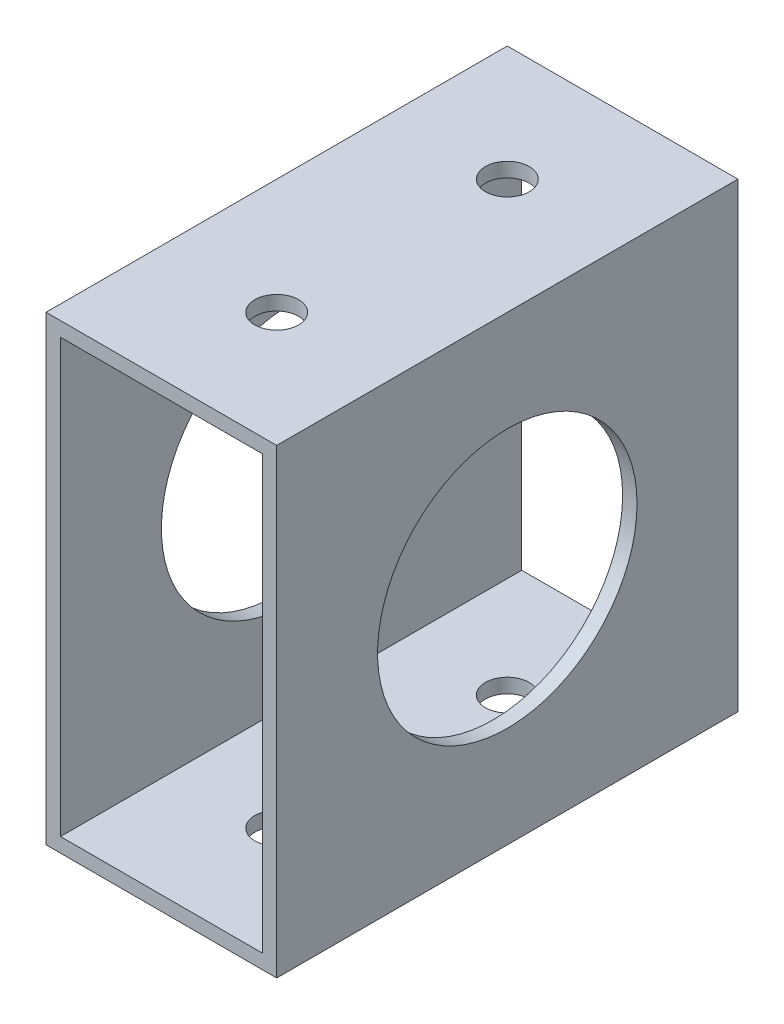
ISO-10303-21;
HEADER;
FILE_DESCRIPTION(('STEP AP214'),'2;1');
FILE_NAME('part.step','',(''),(''),'','','');
FILE_SCHEMA(('AUTOMOTIVE_DESIGN { 1 0 10303 214 1 1 1 1 }'));
ENDSEC;
DATA;
#1=APPLICATION_CONTEXT('core data for automotive mechanical design processes');
#2=APPLICATION_PROTOCOL_DEFINITION('international standard','automotive_design',2000,#1);
#3=PRODUCT_CONTEXT('',#1,'mechanical');
#4=PRODUCT('Part','Part','',(#3));
#5=PRODUCT_RELATED_PRODUCT_CATEGORY('part','',(#4));
#6=PRODUCT_DEFINITION_FORMATION('','',#4);
#7=PRODUCT_DEFINITION_CONTEXT('part definition',#1,'design');
#8=PRODUCT_DEFINITION('design','',#6,#7);
#9=PRODUCT_DEFINITION_SHAPE('','',#8);
#10=(LENGTH_UNIT() NAMED_UNIT(*) SI_UNIT(.MILLI.,.METRE.));
#11=(NAMED_UNIT(*) PLANE_ANGLE_UNIT() SI_UNIT($,.RADIAN.));
#12=(NAMED_UNIT(*) SI_UNIT($,.STERADIAN.) SOLID_ANGLE_UNIT());
#13=UNCERTAINTY_MEASURE_WITH_UNIT(LENGTH_MEASURE(1.E-05),#10,'distance_accuracy_value','');
#14=(GEOMETRIC_REPRESENTATION_CONTEXT(3) GLOBAL_UNCERTAINTY_ASSIGNED_CONTEXT((#13)) GLOBAL_UNIT_ASSIGNED_CONTEXT((#10,
#11,#12)) REPRESENTATION_CONTEXT('',''));
#15=CARTESIAN_POINT('',(0.,0.,0.));
#16=DIRECTION('',(0.,0.,1.));
#17=DIRECTION('',(1.,0.,0.));
#18=AXIS2_PLACEMENT_3D('',#15,#16,#17);
#19=CARTESIAN_POINT('',(0.,0.,50.8));
#20=DIRECTION('',(0.,0.,-1.));
#21=DIRECTION('',(-1.,0.,0.));
#22=AXIS2_PLACEMENT_3D('',#19,#20,#21);
#23=PLANE('',#22);
#24=DIRECTION('',(0.,-1.,0.));
#25=VECTOR('',#24,1.);
#26=CARTESIAN_POINT('',(0.,0.,50.8));
#27=LINE('',#26,#25);
#28=CARTESIAN_POINT('',(0.,50.8,50.8));
#29=VERTEX_POINT('',#28);
#30=CARTESIAN_POINT('',(0.,0.,50.8));
#31=VERTEX_POINT('',#30);
#32=EDGE_CURVE('E138',#29,#31,#27,.T.);
#33=ORIENTED_EDGE('',*,*,#32,.T.);
#34=DIRECTION('',(1.,0.,0.));
#35=VECTOR('',#34,1.);
#36=CARTESIAN_POINT('',(0.,0.,50.8));
#37=LINE('',#36,#35);
#38=CARTESIAN_POINT('',(25.4,0.,50.8));
#39=VERTEX_POINT('',#38);
#40=EDGE_CURVE('E141',#31,#39,#37,.T.);
#41=ORIENTED_EDGE('',*,*,#40,.T.);
#42=DIRECTION('',(0.,1.,0.));
#43=VECTOR('',#42,1.);
#44=CARTESIAN_POINT('',(25.4,0.,50.8));
#45=LINE('',#44,#43);
#46=CARTESIAN_POINT('',(25.4,50.8,50.8));
#47=VERTEX_POINT('',#46);
#48=EDGE_CURVE('E144',#39,#47,#45,.T.);
#49=ORIENTED_EDGE('',*,*,#48,.T.);
#50=DIRECTION('',(-1.,0.,0.));
#51=VECTOR('',#50,1.);
#52=CARTESIAN_POINT('',(0.,50.8,50.8));
#53=LINE('',#52,#51);
#54=EDGE_CURVE('E146',#47,#29,#53,.T.);
#55=ORIENTED_EDGE('',*,*,#54,.T.);
#56=EDGE_LOOP('',(#33,#41,#49,#55));
#57=FACE_BOUND('',#56,.T.);
#58=DIRECTION('',(0.,-1.,0.));
#59=VECTOR('',#58,1.);
#60=CARTESIAN_POINT('',(1.5875,49.2125,50.8));
#61=LINE('',#60,#59);
#62=CARTESIAN_POINT('',(1.5875,49.2125,50.8));
#63=VERTEX_POINT('',#62);
#64=CARTESIAN_POINT('',(1.58750000000001,1.5875,50.8));
#65=VERTEX_POINT('',#64);
#66=EDGE_CURVE('E100',#63,#65,#61,.T.);
#67=ORIENTED_EDGE('',*,*,#66,.F.);
#68=DIRECTION('',(-1.,0.,0.));
#69=VECTOR('',#68,1.);
#70=CARTESIAN_POINT('',(1.5875,49.2125,50.8));
#71=LINE('',#70,#69);
#72=CARTESIAN_POINT('',(23.8125,49.2125,50.8));
#73=VERTEX_POINT('',#72);
#74=EDGE_CURVE('E122',#73,#63,#71,.T.);
#75=ORIENTED_EDGE('',*,*,#74,.F.);
#76=DIRECTION('',(0.,1.,0.));
#77=VECTOR('',#76,1.);
#78=CARTESIAN_POINT('',(23.8125,49.2125,50.8));
#79=LINE('',#78,#77);
#80=CARTESIAN_POINT('',(23.8125,1.5875,50.8));
#81=VERTEX_POINT('',#80);
#82=EDGE_CURVE('E120',#81,#73,#79,.T.);
#83=ORIENTED_EDGE('',*,*,#82,.F.);
#84=DIRECTION('',(1.,0.,0.));
#85=VECTOR('',#84,1.);
#86=CARTESIAN_POINT('',(1.58750000000001,1.5875,50.8));
#87=LINE('',#86,#85);
#88=EDGE_CURVE('E108',#65,#81,#87,.T.);
#89=ORIENTED_EDGE('',*,*,#88,.F.);
#90=EDGE_LOOP('',(#67,#75,#83,#89));
#91=FACE_BOUND('',#90,.T.);
#92=ADVANCED_FACE('F33',(#57,#91),#23,.F.);
#93=CARTESIAN_POINT('',(0.,0.,0.));
#94=DIRECTION('',(0.,0.,-1.));
#95=DIRECTION('',(-1.,0.,0.));
#96=AXIS2_PLACEMENT_3D('',#93,#94,#95);
#97=PLANE('',#96);
#98=DIRECTION('',(0.,-1.,0.));
#99=VECTOR('',#98,1.);
#100=CARTESIAN_POINT('',(0.,0.,0.));
#101=LINE('',#100,#99);
#102=CARTESIAN_POINT('',(0.,50.8,0.));
#103=VERTEX_POINT('',#102);
#104=CARTESIAN_POINT('',(0.,0.,0.));
#105=VERTEX_POINT('',#104);
#106=EDGE_CURVE('E116',#103,#105,#101,.T.);
#107=ORIENTED_EDGE('',*,*,#106,.F.);
#108=DIRECTION('',(-1.,0.,0.));
#109=VECTOR('',#108,1.);
#110=CARTESIAN_POINT('',(0.,50.8,0.));
#111=LINE('',#110,#109);
#112=CARTESIAN_POINT('',(25.4,50.8,0.));
#113=VERTEX_POINT('',#112);
#114=EDGE_CURVE('E142',#113,#103,#111,.T.);
#115=ORIENTED_EDGE('',*,*,#114,.F.);
#116=DIRECTION('',(0.,1.,0.));
#117=VECTOR('',#116,1.);
#118=CARTESIAN_POINT('',(25.4,0.,0.));
#119=LINE('',#118,#117);
#120=CARTESIAN_POINT('',(25.4,0.,0.));
#121=VERTEX_POINT('',#120);
#122=EDGE_CURVE('E153',#121,#113,#119,.T.);
#123=ORIENTED_EDGE('',*,*,#122,.F.);
#124=DIRECTION('',(1.,0.,0.));
#125=VECTOR('',#124,1.);
#126=CARTESIAN_POINT('',(0.,0.,0.));
#127=LINE('',#126,#125);
#128=EDGE_CURVE('E151',#105,#121,#127,.T.);
#129=ORIENTED_EDGE('',*,*,#128,.F.);
#130=EDGE_LOOP('',(#107,#115,#123,#129));
#131=FACE_BOUND('',#130,.T.);
#132=DIRECTION('',(-1.,0.,0.));
#133=VECTOR('',#132,1.);
#134=CARTESIAN_POINT('',(1.5875,49.2125,0.));
#135=LINE('',#134,#133);
#136=CARTESIAN_POINT('',(23.8125,49.2125,0.));
#137=VERTEX_POINT('',#136);
#138=CARTESIAN_POINT('',(1.5875,49.2125,0.));
#139=VERTEX_POINT('',#138);
#140=EDGE_CURVE('E109',#137,#139,#135,.T.);
#141=ORIENTED_EDGE('',*,*,#140,.T.);
#142=DIRECTION('',(0.,-1.,0.));
#143=VECTOR('',#142,1.);
#144=CARTESIAN_POINT('',(1.5875,49.2125,0.));
#145=LINE('',#144,#143);
#146=CARTESIAN_POINT('',(1.58750000000001,1.5875,0.));
#147=VERTEX_POINT('',#146);
#148=EDGE_CURVE('E58',#139,#147,#145,.T.);
#149=ORIENTED_EDGE('',*,*,#148,.T.);
#150=DIRECTION('',(1.,0.,0.));
#151=VECTOR('',#150,1.);
#152=CARTESIAN_POINT('',(1.58750000000001,1.5875,0.));
#153=LINE('',#152,#151);
#154=CARTESIAN_POINT('',(23.8125,1.5875,0.));
#155=VERTEX_POINT('',#154);
#156=EDGE_CURVE('E115',#147,#155,#153,.T.);
#157=ORIENTED_EDGE('',*,*,#156,.T.);
#158=DIRECTION('',(0.,1.,0.));
#159=VECTOR('',#158,1.);
#160=CARTESIAN_POINT('',(23.8125,49.2125,0.));
#161=LINE('',#160,#159);
#162=EDGE_CURVE('E130',#155,#137,#161,.T.);
#163=ORIENTED_EDGE('',*,*,#162,.T.);
#164=EDGE_LOOP('',(#141,#149,#157,#163));
#165=FACE_BOUND('',#164,.T.);
#166=ADVANCED_FACE('F211',(#131,#165),#97,.T.);
#167=CARTESIAN_POINT('',(0.,0.,50.8));
#168=DIRECTION('',(1.,0.,0.));
#169=DIRECTION('',(0.,0.,-1.));
#170=AXIS2_PLACEMENT_3D('',#167,#168,#169);
#171=PLANE('',#170);
#172=CARTESIAN_POINT('',(0.,25.4,25.4));
#173=DIRECTION('',(1.,0.,0.));
#174=DIRECTION('',(0.,0.,-1.));
#175=AXIS2_PLACEMENT_3D('',#172,#173,#174);
#176=CIRCLE('',#175,14.2875);
#177=CARTESIAN_POINT('',(0.,25.4,11.1125));
#178=VERTEX_POINT('',#177);
#179=EDGE_CURVE('E194',#178,#178,#176,.T.);
#180=ORIENTED_EDGE('',*,*,#179,.T.);
#181=EDGE_LOOP('',(#180));
#182=FACE_BOUND('',#181,.T.);
#183=ORIENTED_EDGE('',*,*,#106,.T.);
#184=DIRECTION('',(0.,0.,-1.));
#185=VECTOR('',#184,1.);
#186=CARTESIAN_POINT('',(0.,0.,50.8));
#187=LINE('',#186,#185);
#188=EDGE_CURVE('E11',#31,#105,#187,.T.);
#189=ORIENTED_EDGE('',*,*,#188,.F.);
#190=ORIENTED_EDGE('',*,*,#32,.F.);
#191=DIRECTION('',(0.,0.,-1.));
#192=VECTOR('',#191,1.);
#193=CARTESIAN_POINT('',(0.,50.8,50.8));
#194=LINE('',#193,#192);
#195=EDGE_CURVE('E148',#29,#103,#194,.T.);
#196=ORIENTED_EDGE('',*,*,#195,.T.);
#197=EDGE_LOOP('',(#183,#189,#190,#196));
#198=FACE_BOUND('',#197,.T.);
#199=ADVANCED_FACE('F35',(#182,#198),#171,.F.);
#200=CARTESIAN_POINT('',(0.,0.,50.8));
#201=DIRECTION('',(0.,1.,0.));
#202=DIRECTION('',(0.,0.,1.));
#203=AXIS2_PLACEMENT_3D('',#200,#201,#202);
#204=PLANE('',#203);
#205=CARTESIAN_POINT('',(12.7,0.,12.7));
#206=DIRECTION('',(0.,1.,0.));
#207=DIRECTION('',(0.,0.,1.));
#208=AXIS2_PLACEMENT_3D('',#205,#206,#207);
#209=CIRCLE('',#208,2.41299999999999);
#210=CARTESIAN_POINT('',(12.7,0.,15.113));
#211=VERTEX_POINT('',#210);
#212=EDGE_CURVE('E166',#211,#211,#209,.T.);
#213=ORIENTED_EDGE('',*,*,#212,.T.);
#214=EDGE_LOOP('',(#213));
#215=FACE_BOUND('',#214,.T.);
#216=CARTESIAN_POINT('',(12.7,0.,38.1));
#217=DIRECTION('',(0.,1.,0.));
#218=DIRECTION('',(0.,0.,1.));
#219=AXIS2_PLACEMENT_3D('',#216,#217,#218);
#220=CIRCLE('',#219,2.413);
#221=CARTESIAN_POINT('',(12.7,0.,40.513));
#222=VERTEX_POINT('',#221);
#223=EDGE_CURVE('E180',#222,#222,#220,.T.);
#224=ORIENTED_EDGE('',*,*,#223,.T.);
#225=EDGE_LOOP('',(#224));
#226=FACE_BOUND('',#225,.T.);
#227=ORIENTED_EDGE('',*,*,#128,.T.);
#228=DIRECTION('',(0.,0.,-1.));
#229=VECTOR('',#228,1.);
#230=CARTESIAN_POINT('',(25.4,0.,50.8));
#231=LINE('',#230,#229);
#232=EDGE_CURVE('E42',#39,#121,#231,.T.);
#233=ORIENTED_EDGE('',*,*,#232,.F.);
#234=ORIENTED_EDGE('',*,*,#40,.F.);
#235=ORIENTED_EDGE('',*,*,#188,.T.);
#236=EDGE_LOOP('',(#227,#233,#234,#235));
#237=FACE_BOUND('',#236,.T.);
#238=ADVANCED_FACE('F241',(#215,#226,#237),#204,.F.);
#239=CARTESIAN_POINT('',(25.4,0.,50.8));
#240=DIRECTION('',(-1.,0.,0.));
#241=DIRECTION('',(0.,0.,1.));
#242=AXIS2_PLACEMENT_3D('',#239,#240,#241);
#243=PLANE('',#242);
#244=CARTESIAN_POINT('',(25.4,25.4,25.4));
#245=DIRECTION('',(1.,0.,0.));
#246=DIRECTION('',(0.,0.,-1.));
#247=AXIS2_PLACEMENT_3D('',#244,#245,#246);
#248=CIRCLE('',#247,14.2875);
#249=CARTESIAN_POINT('',(25.4,25.4,11.1125));
#250=VERTEX_POINT('',#249);
#251=EDGE_CURVE('E191',#250,#250,#248,.T.);
#252=ORIENTED_EDGE('',*,*,#251,.F.);
#253=EDGE_LOOP('',(#252));
#254=FACE_BOUND('',#253,.T.);
#255=ORIENTED_EDGE('',*,*,#122,.T.);
#256=DIRECTION('',(0.,0.,-1.));
#257=VECTOR('',#256,1.);
#258=CARTESIAN_POINT('',(25.4,50.8,50.8));
#259=LINE('',#258,#257);
#260=EDGE_CURVE('E158',#47,#113,#259,.T.);
#261=ORIENTED_EDGE('',*,*,#260,.F.);
#262=ORIENTED_EDGE('',*,*,#48,.F.);
#263=ORIENTED_EDGE('',*,*,#232,.T.);
#264=EDGE_LOOP('',(#255,#261,#262,#263));
#265=FACE_BOUND('',#264,.T.);
#266=ADVANCED_FACE('F238',(#254,#265),#243,.F.);
#267=CARTESIAN_POINT('',(0.,50.8,50.8));
#268=DIRECTION('',(0.,-1.,0.));
#269=DIRECTION('',(0.,0.,-1.));
#270=AXIS2_PLACEMENT_3D('',#267,#268,#269);
#271=PLANE('',#270);
#272=CARTESIAN_POINT('',(12.7,50.8,12.7));
#273=DIRECTION('',(0.,1.,0.));
#274=DIRECTION('',(0.,0.,1.));
#275=AXIS2_PLACEMENT_3D('',#272,#273,#274);
#276=CIRCLE('',#275,2.41299999999999);
#277=CARTESIAN_POINT('',(12.7,50.8,15.113));
#278=VERTEX_POINT('',#277);
#279=EDGE_CURVE('E184',#278,#278,#276,.T.);
#280=ORIENTED_EDGE('',*,*,#279,.F.);
#281=EDGE_LOOP('',(#280));
#282=FACE_BOUND('',#281,.T.);
#283=CARTESIAN_POINT('',(12.7,50.8,38.1));
#284=DIRECTION('',(0.,1.,0.));
#285=DIRECTION('',(0.,0.,1.));
#286=AXIS2_PLACEMENT_3D('',#283,#284,#285);
#287=CIRCLE('',#286,2.413);
#288=CARTESIAN_POINT('',(12.7,50.8,40.513));
#289=VERTEX_POINT('',#288);
#290=EDGE_CURVE('E177',#289,#289,#287,.T.);
#291=ORIENTED_EDGE('',*,*,#290,.F.);
#292=EDGE_LOOP('',(#291));
#293=FACE_BOUND('',#292,.T.);
#294=ORIENTED_EDGE('',*,*,#114,.T.);
#295=ORIENTED_EDGE('',*,*,#195,.F.);
#296=ORIENTED_EDGE('',*,*,#54,.F.);
#297=ORIENTED_EDGE('',*,*,#260,.T.);
#298=EDGE_LOOP('',(#294,#295,#296,#297));
#299=FACE_BOUND('',#298,.T.);
#300=ADVANCED_FACE('F235',(#282,#293,#299),#271,.F.);
#301=CARTESIAN_POINT('',(1.5875,49.2125,50.8));
#302=DIRECTION('',(1.,0.,0.));
#303=DIRECTION('',(0.,1.,0.));
#304=AXIS2_PLACEMENT_3D('',#301,#302,#303);
#305=PLANE('',#304);
#306=CARTESIAN_POINT('',(1.5875,25.4,25.4));
#307=DIRECTION('',(1.,0.,0.));
#308=DIRECTION('',(0.,1.,0.));
#309=AXIS2_PLACEMENT_3D('',#306,#307,#308);
#310=CIRCLE('',#309,14.2875);
#311=CARTESIAN_POINT('',(1.5875,25.4,11.1125));
#312=VERTEX_POINT('',#311);
#313=EDGE_CURVE('E181',#312,#312,#310,.T.);
#314=ORIENTED_EDGE('',*,*,#313,.F.);
#315=EDGE_LOOP('',(#314));
#316=FACE_BOUND('',#315,.T.);
#317=ORIENTED_EDGE('',*,*,#148,.F.);
#318=DIRECTION('',(0.,0.,-1.));
#319=VECTOR('',#318,1.);
#320=CARTESIAN_POINT('',(1.5875,49.2125,50.8));
#321=LINE('',#320,#319);
#322=EDGE_CURVE('E104',#63,#139,#321,.T.);
#323=ORIENTED_EDGE('',*,*,#322,.F.);
#324=ORIENTED_EDGE('',*,*,#66,.T.);
#325=DIRECTION('',(0.,0.,-1.));
#326=VECTOR('',#325,1.);
#327=CARTESIAN_POINT('',(1.58750000000001,1.5875,50.8));
#328=LINE('',#327,#326);
#329=EDGE_CURVE('E103',#65,#147,#328,.T.);
#330=ORIENTED_EDGE('',*,*,#329,.T.);
#331=EDGE_LOOP('',(#317,#323,#324,#330));
#332=FACE_BOUND('',#331,.T.);
#333=ADVANCED_FACE('F102',(#316,#332),#305,.T.);
#334=CARTESIAN_POINT('',(1.58750000000001,1.5875,50.8));
#335=DIRECTION('',(0.,1.,0.));
#336=DIRECTION('',(-1.,0.,0.));
#337=AXIS2_PLACEMENT_3D('',#334,#335,#336);
#338=PLANE('',#337);
#339=CARTESIAN_POINT('',(12.7,1.5875,12.7));
#340=DIRECTION('',(0.,1.,0.));
#341=DIRECTION('',(-1.,0.,0.));
#342=AXIS2_PLACEMENT_3D('',#339,#340,#341);
#343=CIRCLE('',#342,2.41299999999999);
#344=CARTESIAN_POINT('',(10.287,1.5875,12.7));
#345=VERTEX_POINT('',#344);
#346=EDGE_CURVE('E128',#345,#345,#343,.T.);
#347=ORIENTED_EDGE('',*,*,#346,.F.);
#348=EDGE_LOOP('',(#347));
#349=FACE_BOUND('',#348,.T.);
#350=CARTESIAN_POINT('',(12.7,1.5875,38.1));
#351=DIRECTION('',(0.,1.,0.));
#352=DIRECTION('',(-1.,0.,0.));
#353=AXIS2_PLACEMENT_3D('',#350,#351,#352);
#354=CIRCLE('',#353,2.413);
#355=CARTESIAN_POINT('',(10.287,1.5875,38.1));
#356=VERTEX_POINT('',#355);
#357=EDGE_CURVE('E165',#356,#356,#354,.T.);
#358=ORIENTED_EDGE('',*,*,#357,.F.);
#359=EDGE_LOOP('',(#358));
#360=FACE_BOUND('',#359,.T.);
#361=ORIENTED_EDGE('',*,*,#156,.F.);
#362=ORIENTED_EDGE('',*,*,#329,.F.);
#363=ORIENTED_EDGE('',*,*,#88,.T.);
#364=DIRECTION('',(0.,0.,-1.));
#365=VECTOR('',#364,1.);
#366=CARTESIAN_POINT('',(23.8125,1.5875,50.8));
#367=LINE('',#366,#365);
#368=EDGE_CURVE('E117',#81,#155,#367,.T.);
#369=ORIENTED_EDGE('',*,*,#368,.T.);
#370=EDGE_LOOP('',(#361,#362,#363,#369));
#371=FACE_BOUND('',#370,.T.);
#372=ADVANCED_FACE('F112',(#349,#360,#371),#338,.T.);
#373=CARTESIAN_POINT('',(23.8125,49.2125,50.8));
#374=DIRECTION('',(-1.,0.,0.));
#375=DIRECTION('',(0.,-1.,0.));
#376=AXIS2_PLACEMENT_3D('',#373,#374,#375);
#377=PLANE('',#376);
#378=CARTESIAN_POINT('',(23.8125,25.4,25.4));
#379=DIRECTION('',(-1.,0.,0.));
#380=DIRECTION('',(0.,-1.,0.));
#381=AXIS2_PLACEMENT_3D('',#378,#379,#380);
#382=CIRCLE('',#381,14.2875);
#383=CARTESIAN_POINT('',(23.8125,25.4,11.1125));
#384=VERTEX_POINT('',#383);
#385=EDGE_CURVE('E37',#384,#384,#382,.T.);
#386=ORIENTED_EDGE('',*,*,#385,.F.);
#387=EDGE_LOOP('',(#386));
#388=FACE_BOUND('',#387,.T.);
#389=ORIENTED_EDGE('',*,*,#162,.F.);
#390=ORIENTED_EDGE('',*,*,#368,.F.);
#391=ORIENTED_EDGE('',*,*,#82,.T.);
#392=DIRECTION('',(0.,0.,-1.));
#393=VECTOR('',#392,1.);
#394=CARTESIAN_POINT('',(23.8125,49.2125,50.8));
#395=LINE('',#394,#393);
#396=EDGE_CURVE('E50',#73,#137,#395,.T.);
#397=ORIENTED_EDGE('',*,*,#396,.T.);
#398=EDGE_LOOP('',(#389,#390,#391,#397));
#399=FACE_BOUND('',#398,.T.);
#400=ADVANCED_FACE('F204',(#388,#399),#377,.T.);
#401=CARTESIAN_POINT('',(1.5875,49.2125,50.8));
#402=DIRECTION('',(0.,-1.,0.));
#403=DIRECTION('',(0.,0.,-1.));
#404=AXIS2_PLACEMENT_3D('',#401,#402,#403);
#405=PLANE('',#404);
#406=CARTESIAN_POINT('',(12.7,49.2125,12.7));
#407=DIRECTION('',(0.,-1.,0.));
#408=DIRECTION('',(0.,0.,-1.));
#409=AXIS2_PLACEMENT_3D('',#406,#407,#408);
#410=CIRCLE('',#409,2.41299999999999);
#411=CARTESIAN_POINT('',(12.7,49.2125,10.287));
#412=VERTEX_POINT('',#411);
#413=EDGE_CURVE('E167',#412,#412,#410,.T.);
#414=ORIENTED_EDGE('',*,*,#413,.F.);
#415=EDGE_LOOP('',(#414));
#416=FACE_BOUND('',#415,.T.);
#417=CARTESIAN_POINT('',(12.7,49.2125,38.1));
#418=DIRECTION('',(0.,-1.,0.));
#419=DIRECTION('',(0.,0.,-1.));
#420=AXIS2_PLACEMENT_3D('',#417,#418,#419);
#421=CIRCLE('',#420,2.413);
#422=CARTESIAN_POINT('',(12.7,49.2125,35.687));
#423=VERTEX_POINT('',#422);
#424=EDGE_CURVE('E163',#423,#423,#421,.T.);
#425=ORIENTED_EDGE('',*,*,#424,.F.);
#426=EDGE_LOOP('',(#425));
#427=FACE_BOUND('',#426,.T.);
#428=ORIENTED_EDGE('',*,*,#140,.F.);
#429=ORIENTED_EDGE('',*,*,#396,.F.);
#430=ORIENTED_EDGE('',*,*,#74,.T.);
#431=ORIENTED_EDGE('',*,*,#322,.T.);
#432=EDGE_LOOP('',(#428,#429,#430,#431));
#433=FACE_BOUND('',#432,.T.);
#434=ADVANCED_FACE('F207',(#416,#427,#433),#405,.T.);
#435=CARTESIAN_POINT('',(12.7,0.,38.1));
#436=DIRECTION('',(0.,1.,0.));
#437=DIRECTION('',(0.,0.,1.));
#438=AXIS2_PLACEMENT_3D('',#435,#436,#437);
#439=CYLINDRICAL_SURFACE('',#438,2.413);
#440=ORIENTED_EDGE('',*,*,#424,.T.);
#441=EDGE_LOOP('',(#440));
#442=FACE_BOUND('',#441,.T.);
#443=ORIENTED_EDGE('',*,*,#290,.T.);
#444=EDGE_LOOP('',(#443));
#445=FACE_BOUND('',#444,.T.);
#446=ADVANCED_FACE('F213',(#442,#445),#439,.F.);
#447=CARTESIAN_POINT('',(12.7,0.,12.7));
#448=DIRECTION('',(0.,1.,0.));
#449=DIRECTION('',(0.,0.,1.));
#450=AXIS2_PLACEMENT_3D('',#447,#448,#449);
#451=CYLINDRICAL_SURFACE('',#450,2.41299999999999);
#452=ORIENTED_EDGE('',*,*,#413,.T.);
#453=EDGE_LOOP('',(#452));
#454=FACE_BOUND('',#453,.T.);
#455=ORIENTED_EDGE('',*,*,#279,.T.);
#456=EDGE_LOOP('',(#455));
#457=FACE_BOUND('',#456,.T.);
#458=ADVANCED_FACE('F219',(#454,#457),#451,.F.);
#459=ORIENTED_EDGE('',*,*,#357,.T.);
#460=EDGE_LOOP('',(#459));
#461=FACE_BOUND('',#460,.T.);
#462=ORIENTED_EDGE('',*,*,#223,.F.);
#463=EDGE_LOOP('',(#462));
#464=FACE_BOUND('',#463,.T.);
#465=ADVANCED_FACE('F222',(#461,#464),#439,.F.);
#466=ORIENTED_EDGE('',*,*,#346,.T.);
#467=EDGE_LOOP('',(#466));
#468=FACE_BOUND('',#467,.T.);
#469=ORIENTED_EDGE('',*,*,#212,.F.);
#470=EDGE_LOOP('',(#469));
#471=FACE_BOUND('',#470,.T.);
#472=ADVANCED_FACE('F267',(#468,#471),#451,.F.);
#473=CARTESIAN_POINT('',(0.,25.4,25.4));
#474=DIRECTION('',(1.,0.,0.));
#475=DIRECTION('',(0.,0.,-1.));
#476=AXIS2_PLACEMENT_3D('',#473,#474,#475);
#477=CYLINDRICAL_SURFACE('',#476,14.2875);
#478=CARTESIAN_POINT('',(23.8125,25.4,11.1125));
#479=CARTESIAN_POINT('',(23.8290364583333,25.4,11.1125));
#480=CARTESIAN_POINT('',(23.8455729166666,25.4,11.1125));
#481=CARTESIAN_POINT('',(23.8786458333333,25.4,11.1125));
#482=CARTESIAN_POINT('',(23.8951822916667,25.4,11.1125));
#483=CARTESIAN_POINT('',(23.9282552083333,25.4,11.1125));
#484=CARTESIAN_POINT('',(23.9447916666666,25.4,11.1125));
#485=CARTESIAN_POINT('',(23.9778645833333,25.4,11.1125));
#486=CARTESIAN_POINT('',(23.9944010416667,25.4,11.1125));
#487=CARTESIAN_POINT('',(24.0274739583333,25.4,11.1125));
#488=CARTESIAN_POINT('',(24.0440104166667,25.4,11.1125));
#489=CARTESIAN_POINT('',(24.0770833333333,25.4,11.1125));
#490=CARTESIAN_POINT('',(24.0936197916667,25.4,11.1125));
#491=CARTESIAN_POINT('',(24.1266927083333,25.4,11.1125));
#492=CARTESIAN_POINT('',(24.1432291666667,25.4,11.1125));
#493=CARTESIAN_POINT('',(24.1763020833333,25.4,11.1125));
#494=CARTESIAN_POINT('',(24.1928385416666,25.4,11.1125));
#495=CARTESIAN_POINT('',(24.2259114583333,25.4,11.1125));
#496=CARTESIAN_POINT('',(24.2424479166666,25.4,11.1125));
#497=CARTESIAN_POINT('',(24.2755208333333,25.4,11.1125));
#498=CARTESIAN_POINT('',(24.2920572916667,25.4,11.1125));
#499=CARTESIAN_POINT('',(24.3251302083333,25.4,11.1125));
#500=CARTESIAN_POINT('',(24.3416666666667,25.4,11.1125));
#501=CARTESIAN_POINT('',(24.3747395833333,25.4,11.1125));
#502=CARTESIAN_POINT('',(24.3912760416667,25.4,11.1125));
#503=CARTESIAN_POINT('',(24.4243489583333,25.4,11.1125));
#504=CARTESIAN_POINT('',(24.4408854166667,25.4,11.1125));
#505=CARTESIAN_POINT('',(24.4739583333333,25.4,11.1125));
#506=CARTESIAN_POINT('',(24.4904947916666,25.4,11.1125));
#507=CARTESIAN_POINT('',(24.5235677083333,25.4,11.1125));
#508=CARTESIAN_POINT('',(24.5401041666667,25.4,11.1125));
#509=CARTESIAN_POINT('',(24.5731770833333,25.4,11.1125));
#510=CARTESIAN_POINT('',(24.5897135416667,25.4,11.1125));
#511=CARTESIAN_POINT('',(24.6227864583333,25.4,11.1125));
#512=CARTESIAN_POINT('',(24.6393229166667,25.4,11.1125));
#513=CARTESIAN_POINT('',(24.6723958333333,25.4,11.1125));
#514=CARTESIAN_POINT('',(24.6889322916667,25.4,11.1125));
#515=CARTESIAN_POINT('',(24.7220052083333,25.4,11.1125));
#516=CARTESIAN_POINT('',(24.7385416666667,25.4,11.1125));
#517=CARTESIAN_POINT('',(24.7716145833333,25.4,11.1125));
#518=CARTESIAN_POINT('',(24.7881510416667,25.4,11.1125));
#519=CARTESIAN_POINT('',(24.8212239583333,25.4,11.1125));
#520=CARTESIAN_POINT('',(24.8377604166667,25.4,11.1125));
#521=CARTESIAN_POINT('',(24.8708333333333,25.4,11.1125));
#522=CARTESIAN_POINT('',(24.8873697916667,25.4,11.1125));
#523=CARTESIAN_POINT('',(24.9204427083333,25.4,11.1125));
#524=CARTESIAN_POINT('',(24.9369791666667,25.4,11.1125));
#525=CARTESIAN_POINT('',(24.9700520833333,25.4,11.1125));
#526=CARTESIAN_POINT('',(24.9865885416667,25.4,11.1125));
#527=CARTESIAN_POINT('',(25.0196614583333,25.4,11.1125));
#528=CARTESIAN_POINT('',(25.0361979166667,25.4,11.1125));
#529=CARTESIAN_POINT('',(25.0692708333333,25.4,11.1125));
#530=CARTESIAN_POINT('',(25.0858072916667,25.4,11.1125));
#531=CARTESIAN_POINT('',(25.1188802083333,25.4,11.1125));
#532=CARTESIAN_POINT('',(25.1354166666667,25.4,11.1125));
#533=CARTESIAN_POINT('',(25.1684895833333,25.4,11.1125));
#534=CARTESIAN_POINT('',(25.1850260416667,25.4,11.1125));
#535=CARTESIAN_POINT('',(25.2180989583333,25.4,11.1125));
#536=CARTESIAN_POINT('',(25.2346354166667,25.4,11.1125));
#537=CARTESIAN_POINT('',(25.2677083333333,25.4,11.1125));
#538=CARTESIAN_POINT('',(25.2842447916667,25.4,11.1125));
#539=CARTESIAN_POINT('',(25.3173177083333,25.4,11.1125));
#540=CARTESIAN_POINT('',(25.3338541666667,25.4,11.1125));
#541=CARTESIAN_POINT('',(25.3669270833333,25.4,11.1125));
#542=CARTESIAN_POINT('',(25.3834635416667,25.4,11.1125));
#543=CARTESIAN_POINT('',(25.4,25.4,11.1125));
#544=B_SPLINE_CURVE_WITH_KNOTS('',3,(#478,#479,#480,#481,#482,#483,#484,#485,#486,#487,#488,
#489,#490,#491,#492,#493,#494,#495,#496,#497,#498,#499,#500,#501,#502,#503,#504,#505,#506,#507,
#508,#509,#510,#511,#512,#513,#514,#515,#516,#517,#518,#519,#520,#521,#522,#523,#524,#525,#526,
#527,#528,#529,#530,#531,#532,#533,#534,#535,#536,#537,#538,#539,#540,#541,#542,#543),
.UNSPECIFIED.,.F.,.F.,(4,2,2,2,2,2,2,2,2,2,2,2,2,2,2,2,2,2,2,2,2,2,2,2,2,2,2,2,2,2,2,2,4),(0.,
0.0496093749999989,0.0992187500000012,0.148828125,0.198437500000002,0.248046875000001,
0.29765625,0.347265625000003,0.396875000000001,0.446484375,0.496093750000003,0.545703125000002,
0.5953125,0.644921875000003,0.694531250000002,0.744140625000004,0.793750000000003,
0.843359375000002,0.892968750000004,0.942578125000003,0.992187500000005,1.041796875,1.09140625,
1.14101562500001,1.190625,1.240234375,1.28984375000001,1.339453125,1.3890625,1.43867187500001,
1.48828125,1.53789062500001,1.58750000000001),.UNSPECIFIED.);
#545=EDGE_CURVE('BSEAM201',#384,#250,#544,.T.);
#546=ORIENTED_EDGE('',*,*,#385,.T.);
#547=ORIENTED_EDGE('',*,*,#251,.T.);
#548=ORIENTED_EDGE('',*,*,#545,.T.);
#549=ORIENTED_EDGE('',*,*,#545,.F.);
#550=EDGE_LOOP('',(#546,#548,#547,#549));
#551=FACE_BOUND('',#550,.T.);
#552=ADVANCED_FACE('F201',(#551),#477,.F.);
#553=CARTESIAN_POINT('',(1.5875,25.4,11.1125));
#554=CARTESIAN_POINT('',(1.57096354166667,25.4,11.1125));
#555=CARTESIAN_POINT('',(1.55442708333334,25.4,11.1125));
#556=CARTESIAN_POINT('',(1.52135416666667,25.4,11.1125));
#557=CARTESIAN_POINT('',(1.50481770833334,25.4,11.1125));
#558=CARTESIAN_POINT('',(1.47174479166667,25.4,11.1125));
#559=CARTESIAN_POINT('',(1.45520833333334,25.4,11.1125));
#560=CARTESIAN_POINT('',(1.42213541666667,25.4,11.1125));
#561=CARTESIAN_POINT('',(1.40559895833334,25.4,11.1125));
#562=CARTESIAN_POINT('',(1.37252604166667,25.4,11.1125));
#563=CARTESIAN_POINT('',(1.35598958333334,25.4,11.1125));
#564=CARTESIAN_POINT('',(1.32291666666667,25.4,11.1125));
#565=CARTESIAN_POINT('',(1.30638020833334,25.4,11.1125));
#566=CARTESIAN_POINT('',(1.27330729166667,25.4,11.1125));
#567=CARTESIAN_POINT('',(1.25677083333333,25.4,11.1125));
#568=CARTESIAN_POINT('',(1.22369791666667,25.4,11.1125));
#569=CARTESIAN_POINT('',(1.20716145833333,25.4,11.1125));
#570=CARTESIAN_POINT('',(1.17408854166667,25.4,11.1125));
#571=CARTESIAN_POINT('',(1.15755208333334,25.4,11.1125));
#572=CARTESIAN_POINT('',(1.12447916666667,25.4,11.1125));
#573=CARTESIAN_POINT('',(1.10794270833333,25.4,11.1125));
#574=CARTESIAN_POINT('',(1.07486979166667,25.4,11.1125));
#575=CARTESIAN_POINT('',(1.05833333333333,25.4,11.1125));
#576=CARTESIAN_POINT('',(1.02526041666667,25.4,11.1125));
#577=CARTESIAN_POINT('',(1.00872395833333,25.4,11.1125));
#578=CARTESIAN_POINT('',(0.975651041666668,25.4,11.1125));
#579=CARTESIAN_POINT('',(0.959114583333335,25.4,11.1125));
#580=CARTESIAN_POINT('',(0.926041666666668,25.4,11.1125));
#581=CARTESIAN_POINT('',(0.909505208333335,25.4,11.1125));
#582=CARTESIAN_POINT('',(0.876432291666668,25.4,11.1125));
#583=CARTESIAN_POINT('',(0.859895833333335,25.4,11.1125));
#584=CARTESIAN_POINT('',(0.826822916666668,25.4,11.1125));
#585=CARTESIAN_POINT('',(0.810286458333335,25.4,11.1125));
#586=CARTESIAN_POINT('',(0.777213541666668,25.4,11.1125));
#587=CARTESIAN_POINT('',(0.760677083333335,25.4,11.1125));
#588=CARTESIAN_POINT('',(0.727604166666668,25.4,11.1125));
#589=CARTESIAN_POINT('',(0.711067708333334,25.4,11.1125));
#590=CARTESIAN_POINT('',(0.677994791666668,25.4,11.1125));
#591=CARTESIAN_POINT('',(0.661458333333334,25.4,11.1125));
#592=CARTESIAN_POINT('',(0.628385416666668,25.4,11.1125));
#593=CARTESIAN_POINT('',(0.611848958333334,25.4,11.1125));
#594=CARTESIAN_POINT('',(0.578776041666668,25.4,11.1125));
#595=CARTESIAN_POINT('',(0.562239583333334,25.4,11.1125));
#596=CARTESIAN_POINT('',(0.529166666666667,25.4,11.1125));
#597=CARTESIAN_POINT('',(0.512630208333334,25.4,11.1125));
#598=CARTESIAN_POINT('',(0.479557291666667,25.4,11.1125));
#599=CARTESIAN_POINT('',(0.463020833333334,25.4,11.1125));
#600=CARTESIAN_POINT('',(0.429947916666667,25.4,11.1125));
#601=CARTESIAN_POINT('',(0.413411458333334,25.4,11.1125));
#602=CARTESIAN_POINT('',(0.380338541666667,25.4,11.1125));
#603=CARTESIAN_POINT('',(0.363802083333334,25.4,11.1125));
#604=CARTESIAN_POINT('',(0.330729166666667,25.4,11.1125));
#605=CARTESIAN_POINT('',(0.314192708333334,25.4,11.1125));
#606=CARTESIAN_POINT('',(0.281119791666667,25.4,11.1125));
#607=CARTESIAN_POINT('',(0.264583333333334,25.4,11.1125));
#608=CARTESIAN_POINT('',(0.231510416666667,25.4,11.1125));
#609=CARTESIAN_POINT('',(0.214973958333334,25.4,11.1125));
#610=CARTESIAN_POINT('',(0.181901041666667,25.4,11.1125));
#611=CARTESIAN_POINT('',(0.165364583333334,25.4,11.1125));
#612=CARTESIAN_POINT('',(0.132291666666667,25.4,11.1125));
#613=CARTESIAN_POINT('',(0.115755208333333,25.4,11.1125));
#614=CARTESIAN_POINT('',(0.0826822916666668,25.4,11.1125));
#615=CARTESIAN_POINT('',(0.0661458333333335,25.4,11.1125));
#616=CARTESIAN_POINT('',(0.0330729166666668,25.4,11.1125));
#617=CARTESIAN_POINT('',(0.0165364583333334,25.4,11.1125));
#618=CARTESIAN_POINT('',(0.,25.4,11.1125));
#619=B_SPLINE_CURVE_WITH_KNOTS('',3,(#553,#554,#555,#556,#557,#558,#559,#560,#561,#562,#563,
#564,#565,#566,#567,#568,#569,#570,#571,#572,#573,#574,#575,#576,#577,#578,#579,#580,#581,#582,
#583,#584,#585,#586,#587,#588,#589,#590,#591,#592,#593,#594,#595,#596,#597,#598,#599,#600,#601,
#602,#603,#604,#605,#606,#607,#608,#609,#610,#611,#612,#613,#614,#615,#616,#617,#618),
.UNSPECIFIED.,.F.,.F.,(4,2,2,2,2,2,2,2,2,2,2,2,2,2,2,2,2,2,2,2,2,2,2,2,2,2,2,2,2,2,2,2,4),(0.,
0.0496093750000002,0.0992187500000001,0.148828125,0.1984375,0.248046875,0.297656250000001,
0.347265625000001,0.396875000000001,0.446484375000001,0.496093750000001,0.545703125000001,
0.595312500000001,0.644921875000001,0.694531250000001,0.744140625000001,0.793750000000001,
0.843359375000001,0.892968750000001,0.942578125000001,0.992187500000001,1.041796875,1.09140625,
1.141015625,1.190625,1.240234375,1.28984375,1.339453125,1.3890625,1.438671875,1.48828125,
1.537890625,1.5875),.UNSPECIFIED.);
#620=EDGE_CURVE('BSEAM276',#312,#178,#619,.T.);
#621=ORIENTED_EDGE('',*,*,#313,.T.);
#622=ORIENTED_EDGE('',*,*,#179,.F.);
#623=ORIENTED_EDGE('',*,*,#620,.T.);
#624=ORIENTED_EDGE('',*,*,#620,.F.);
#625=EDGE_LOOP('',(#621,#623,#622,#624));
#626=FACE_BOUND('',#625,.T.);
#627=ADVANCED_FACE('F276',(#626),#477,.F.);
#628=CLOSED_SHELL('',(#92,#166,#199,#238,#266,#300,#333,#372,#400,#434,#446,#458,#465,#472,#552,#627));
#629=MANIFOLD_SOLID_BREP('B2',#628);
#630=ADVANCED_BREP_SHAPE_REPRESENTATION('',(#18,#629),#14);
#631=SHAPE_DEFINITION_REPRESENTATION(#9,#630);
ENDSEC;
END-ISO-10303-21;
